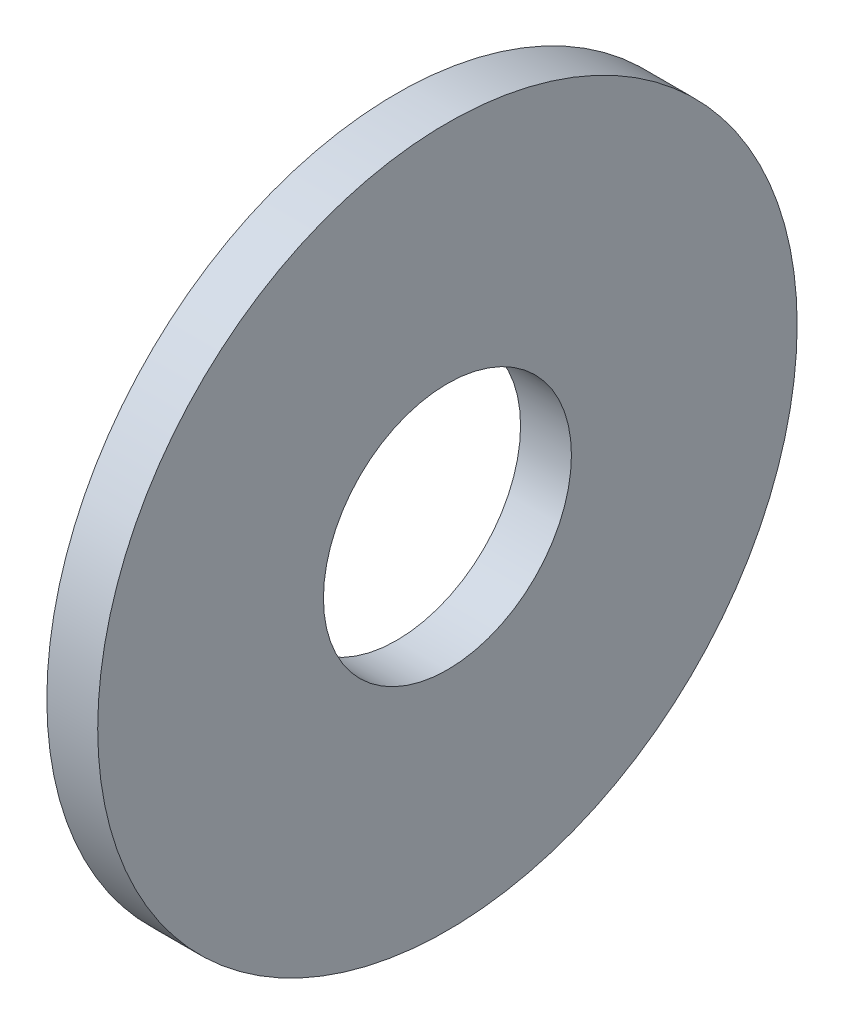
ISO-10303-21;
HEADER;
FILE_DESCRIPTION(('STEP AP214'),'2;1');
FILE_NAME('part.step','',(''),(''),'','','');
FILE_SCHEMA(('AUTOMOTIVE_DESIGN { 1 0 10303 214 1 1 1 1 }'));
ENDSEC;
DATA;
#1=APPLICATION_CONTEXT('core data for automotive mechanical design processes');
#2=APPLICATION_PROTOCOL_DEFINITION('international standard','automotive_design',2000,#1);
#3=PRODUCT_CONTEXT('',#1,'mechanical');
#4=PRODUCT('Part','Part','',(#3));
#5=PRODUCT_RELATED_PRODUCT_CATEGORY('part','',(#4));
#6=PRODUCT_DEFINITION_FORMATION('','',#4);
#7=PRODUCT_DEFINITION_CONTEXT('part definition',#1,'design');
#8=PRODUCT_DEFINITION('design','',#6,#7);
#9=PRODUCT_DEFINITION_SHAPE('','',#8);
#10=(LENGTH_UNIT() NAMED_UNIT(*) SI_UNIT(.MILLI.,.METRE.));
#11=(NAMED_UNIT(*) PLANE_ANGLE_UNIT() SI_UNIT($,.RADIAN.));
#12=(NAMED_UNIT(*) SI_UNIT($,.STERADIAN.) SOLID_ANGLE_UNIT());
#13=UNCERTAINTY_MEASURE_WITH_UNIT(LENGTH_MEASURE(1.E-05),#10,'distance_accuracy_value','');
#14=(GEOMETRIC_REPRESENTATION_CONTEXT(3) GLOBAL_UNCERTAINTY_ASSIGNED_CONTEXT((#13)) GLOBAL_UNIT_ASSIGNED_CONTEXT((#10,
#11,#12)) REPRESENTATION_CONTEXT('',''));
#15=CARTESIAN_POINT('',(0.,0.,0.));
#16=DIRECTION('',(0.,0.,1.));
#17=DIRECTION('',(1.,0.,0.));
#18=AXIS2_PLACEMENT_3D('',#15,#16,#17);
#19=CARTESIAN_POINT('',(-34.9249999999999,0.,0.));
#20=DIRECTION('',(-1.,0.,0.));
#21=DIRECTION('',(0.,0.,1.));
#22=AXIS2_PLACEMENT_3D('',#19,#20,#21);
#23=CYLINDRICAL_SURFACE('',#22,19.5);
#24=CARTESIAN_POINT('',(0.,0.,0.));
#25=DIRECTION('',(-1.,0.,0.));
#26=DIRECTION('',(0.,0.,1.));
#27=AXIS2_PLACEMENT_3D('',#24,#25,#26);
#28=CIRCLE('',#27,19.5);
#29=CARTESIAN_POINT('',(0.,0.,19.5));
#30=VERTEX_POINT('',#29);
#31=EDGE_CURVE('E10',#30,#30,#28,.T.);
#32=ORIENTED_EDGE('',*,*,#31,.F.);
#33=EDGE_LOOP('',(#32));
#34=FACE_BOUND('',#33,.T.);
#35=CARTESIAN_POINT('',(-8.,0.,0.));
#36=DIRECTION('',(-1.,0.,0.));
#37=DIRECTION('',(0.,0.,1.));
#38=AXIS2_PLACEMENT_3D('',#35,#36,#37);
#39=CIRCLE('',#38,19.5);
#40=CARTESIAN_POINT('',(-8.,0.,19.5));
#41=VERTEX_POINT('',#40);
#42=EDGE_CURVE('E44',#41,#41,#39,.T.);
#43=ORIENTED_EDGE('',*,*,#42,.T.);
#44=EDGE_LOOP('',(#43));
#45=FACE_BOUND('',#44,.T.);
#46=ADVANCED_FACE('F30',(#34,#45),#23,.F.);
#47=CARTESIAN_POINT('',(0.,19.5,0.));
#48=DIRECTION('',(-1.,0.,0.));
#49=DIRECTION('',(0.,0.,1.));
#50=AXIS2_PLACEMENT_3D('',#47,#48,#49);
#51=PLANE('',#50);
#52=CARTESIAN_POINT('',(0.,0.,0.));
#53=DIRECTION('',(-1.,0.,0.));
#54=DIRECTION('',(0.,0.,1.));
#55=AXIS2_PLACEMENT_3D('',#52,#53,#54);
#56=CIRCLE('',#55,55.);
#57=CARTESIAN_POINT('',(0.,0.,55.));
#58=VERTEX_POINT('',#57);
#59=EDGE_CURVE('E36',#58,#58,#56,.T.);
#60=ORIENTED_EDGE('',*,*,#59,.F.);
#61=EDGE_LOOP('',(#60));
#62=FACE_BOUND('',#61,.T.);
#63=ORIENTED_EDGE('',*,*,#31,.T.);
#64=EDGE_LOOP('',(#63));
#65=FACE_BOUND('',#64,.T.);
#66=ADVANCED_FACE('F59',(#62,#65),#51,.F.);
#67=CARTESIAN_POINT('',(-34.9249999999999,0.,0.));
#68=DIRECTION('',(-1.,0.,0.));
#69=DIRECTION('',(0.,0.,1.));
#70=AXIS2_PLACEMENT_3D('',#67,#68,#69);
#71=CYLINDRICAL_SURFACE('',#70,55.);
#72=CARTESIAN_POINT('',(-8.,0.,0.));
#73=DIRECTION('',(-1.,0.,0.));
#74=DIRECTION('',(0.,0.,1.));
#75=AXIS2_PLACEMENT_3D('',#72,#73,#74);
#76=CIRCLE('',#75,55.);
#77=CARTESIAN_POINT('',(-8.,0.,55.));
#78=VERTEX_POINT('',#77);
#79=EDGE_CURVE('E40',#78,#78,#76,.T.);
#80=ORIENTED_EDGE('',*,*,#79,.F.);
#81=EDGE_LOOP('',(#80));
#82=FACE_BOUND('',#81,.T.);
#83=ORIENTED_EDGE('',*,*,#59,.T.);
#84=EDGE_LOOP('',(#83));
#85=FACE_BOUND('',#84,.T.);
#86=ADVANCED_FACE('F54',(#82,#85),#71,.T.);
#87=CARTESIAN_POINT('',(-8.,55.,0.));
#88=DIRECTION('',(1.,0.,0.));
#89=DIRECTION('',(0.,0.,-1.));
#90=AXIS2_PLACEMENT_3D('',#87,#88,#89);
#91=PLANE('',#90);
#92=ORIENTED_EDGE('',*,*,#42,.F.);
#93=EDGE_LOOP('',(#92));
#94=FACE_BOUND('',#93,.T.);
#95=ORIENTED_EDGE('',*,*,#79,.T.);
#96=EDGE_LOOP('',(#95));
#97=FACE_BOUND('',#96,.T.);
#98=ADVANCED_FACE('F51',(#94,#97),#91,.F.);
#99=CLOSED_SHELL('',(#46,#66,#86,#98));
#100=MANIFOLD_SOLID_BREP('B2',#99);
#101=ADVANCED_BREP_SHAPE_REPRESENTATION('',(#18,#100),#14);
#102=SHAPE_DEFINITION_REPRESENTATION(#9,#101);
ENDSEC;
END-ISO-10303-21;
